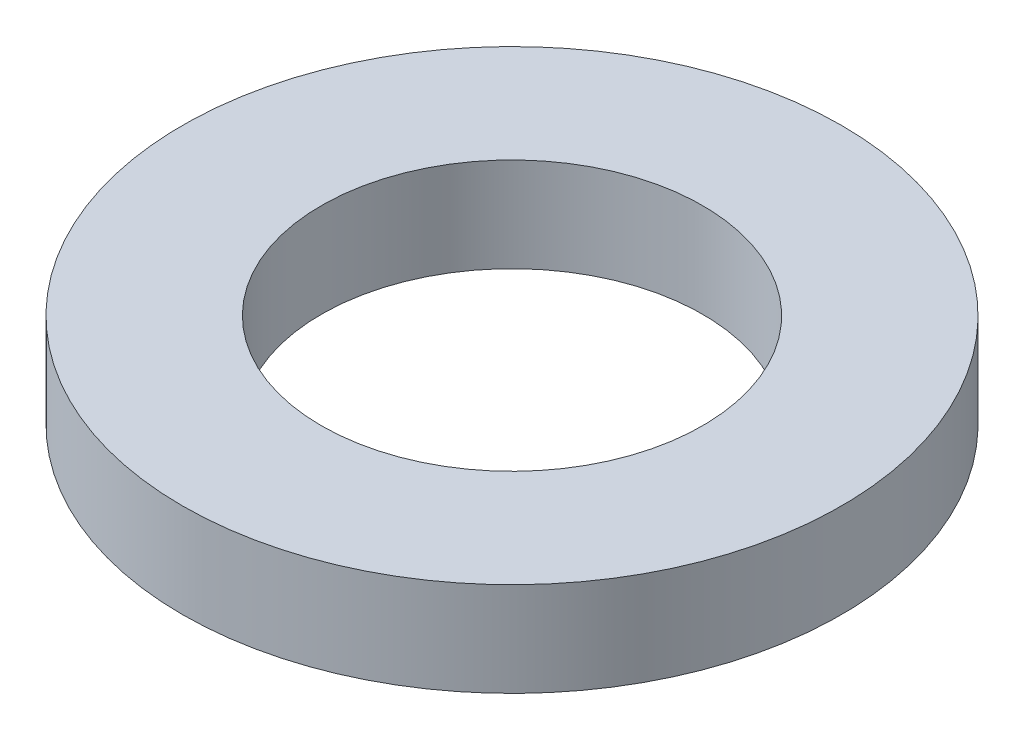
ISO-10303-21;
HEADER;
FILE_DESCRIPTION(('STEP AP214'),'2;1');
FILE_NAME('part.step','',(''),(''),'','','');
FILE_SCHEMA(('AUTOMOTIVE_DESIGN { 1 0 10303 214 1 1 1 1 }'));
ENDSEC;
DATA;
#1=APPLICATION_CONTEXT('core data for automotive mechanical design processes');
#2=APPLICATION_PROTOCOL_DEFINITION('international standard','automotive_design',2000,#1);
#3=PRODUCT_CONTEXT('',#1,'mechanical');
#4=PRODUCT('Part','Part','',(#3));
#5=PRODUCT_RELATED_PRODUCT_CATEGORY('part','',(#4));
#6=PRODUCT_DEFINITION_FORMATION('','',#4);
#7=PRODUCT_DEFINITION_CONTEXT('part definition',#1,'design');
#8=PRODUCT_DEFINITION('design','',#6,#7);
#9=PRODUCT_DEFINITION_SHAPE('','',#8);
#10=(LENGTH_UNIT() NAMED_UNIT(*) SI_UNIT(.MILLI.,.METRE.));
#11=(NAMED_UNIT(*) PLANE_ANGLE_UNIT() SI_UNIT($,.RADIAN.));
#12=(NAMED_UNIT(*) SI_UNIT($,.STERADIAN.) SOLID_ANGLE_UNIT());
#13=UNCERTAINTY_MEASURE_WITH_UNIT(LENGTH_MEASURE(1.E-05),#10,'distance_accuracy_value','');
#14=(GEOMETRIC_REPRESENTATION_CONTEXT(3) GLOBAL_UNCERTAINTY_ASSIGNED_CONTEXT((#13)) GLOBAL_UNIT_ASSIGNED_CONTEXT((#10,
#11,#12)) REPRESENTATION_CONTEXT('',''));
#15=CARTESIAN_POINT('',(0.,0.,0.));
#16=DIRECTION('',(0.,0.,1.));
#17=DIRECTION('',(1.,0.,0.));
#18=AXIS2_PLACEMENT_3D('',#15,#16,#17);
#19=CARTESIAN_POINT('',(0.,2.,0.));
#20=DIRECTION('',(0.,1.,0.));
#21=DIRECTION('',(0.,0.,1.));
#22=AXIS2_PLACEMENT_3D('',#19,#20,#21);
#23=PLANE('',#22);
#24=CARTESIAN_POINT('',(0.,2.,0.));
#25=DIRECTION('',(0.,1.,0.));
#26=DIRECTION('',(0.,0.,1.));
#27=AXIS2_PLACEMENT_3D('',#24,#25,#26);
#28=CIRCLE('',#27,7.);
#29=CARTESIAN_POINT('',(0.,2.,7.));
#30=VERTEX_POINT('',#29);
#31=EDGE_CURVE('E10',#30,#30,#28,.T.);
#32=ORIENTED_EDGE('',*,*,#31,.T.);
#33=EDGE_LOOP('',(#32));
#34=FACE_BOUND('',#33,.T.);
#35=CARTESIAN_POINT('',(0.,2.,0.));
#36=DIRECTION('',(0.,1.,0.));
#37=DIRECTION('',(0.,0.,1.));
#38=AXIS2_PLACEMENT_3D('',#35,#36,#37);
#39=CIRCLE('',#38,4.05);
#40=CARTESIAN_POINT('',(0.,2.,4.05));
#41=VERTEX_POINT('',#40);
#42=EDGE_CURVE('E50',#41,#41,#39,.T.);
#43=ORIENTED_EDGE('',*,*,#42,.F.);
#44=EDGE_LOOP('',(#43));
#45=FACE_BOUND('',#44,.T.);
#46=ADVANCED_FACE('F37',(#34,#45),#23,.T.);
#47=CARTESIAN_POINT('',(0.,0.,0.));
#48=DIRECTION('',(0.,1.,0.));
#49=DIRECTION('',(0.,0.,1.));
#50=AXIS2_PLACEMENT_3D('',#47,#48,#49);
#51=PLANE('',#50);
#52=CARTESIAN_POINT('',(0.,0.,0.));
#53=DIRECTION('',(0.,1.,0.));
#54=DIRECTION('',(0.,0.,1.));
#55=AXIS2_PLACEMENT_3D('',#52,#53,#54);
#56=CIRCLE('',#55,7.);
#57=CARTESIAN_POINT('',(0.,0.,7.));
#58=VERTEX_POINT('',#57);
#59=EDGE_CURVE('E41',#58,#58,#56,.T.);
#60=ORIENTED_EDGE('',*,*,#59,.F.);
#61=EDGE_LOOP('',(#60));
#62=FACE_BOUND('',#61,.T.);
#63=CARTESIAN_POINT('',(0.,0.,0.));
#64=DIRECTION('',(0.,1.,0.));
#65=DIRECTION('',(0.,0.,1.));
#66=AXIS2_PLACEMENT_3D('',#63,#64,#65);
#67=CIRCLE('',#66,4.05);
#68=CARTESIAN_POINT('',(0.,0.,4.05));
#69=VERTEX_POINT('',#68);
#70=EDGE_CURVE('E52',#69,#69,#67,.T.);
#71=ORIENTED_EDGE('',*,*,#70,.T.);
#72=EDGE_LOOP('',(#71));
#73=FACE_BOUND('',#72,.T.);
#74=ADVANCED_FACE('F64',(#62,#73),#51,.F.);
#75=CARTESIAN_POINT('',(0.,2.,0.));
#76=DIRECTION('',(0.,-1.,0.));
#77=DIRECTION('',(0.,0.,-1.));
#78=AXIS2_PLACEMENT_3D('',#75,#76,#77);
#79=CYLINDRICAL_SURFACE('',#78,7.);
#80=ORIENTED_EDGE('',*,*,#31,.F.);
#81=EDGE_LOOP('',(#80));
#82=FACE_BOUND('',#81,.T.);
#83=ORIENTED_EDGE('',*,*,#59,.T.);
#84=EDGE_LOOP('',(#83));
#85=FACE_BOUND('',#84,.T.);
#86=ADVANCED_FACE('F39',(#82,#85),#79,.T.);
#87=CARTESIAN_POINT('',(0.,2.,0.));
#88=DIRECTION('',(0.,-1.,0.));
#89=DIRECTION('',(0.,0.,-1.));
#90=AXIS2_PLACEMENT_3D('',#87,#88,#89);
#91=CYLINDRICAL_SURFACE('',#90,4.05);
#92=ORIENTED_EDGE('',*,*,#42,.T.);
#93=EDGE_LOOP('',(#92));
#94=FACE_BOUND('',#93,.T.);
#95=ORIENTED_EDGE('',*,*,#70,.F.);
#96=EDGE_LOOP('',(#95));
#97=FACE_BOUND('',#96,.T.);
#98=ADVANCED_FACE('F60',(#94,#97),#91,.F.);
#99=CLOSED_SHELL('',(#46,#74,#86,#98));
#100=MANIFOLD_SOLID_BREP('B2',#99);
#101=ADVANCED_BREP_SHAPE_REPRESENTATION('',(#18,#100),#14);
#102=SHAPE_DEFINITION_REPRESENTATION(#9,#101);
ENDSEC;
END-ISO-10303-21;
